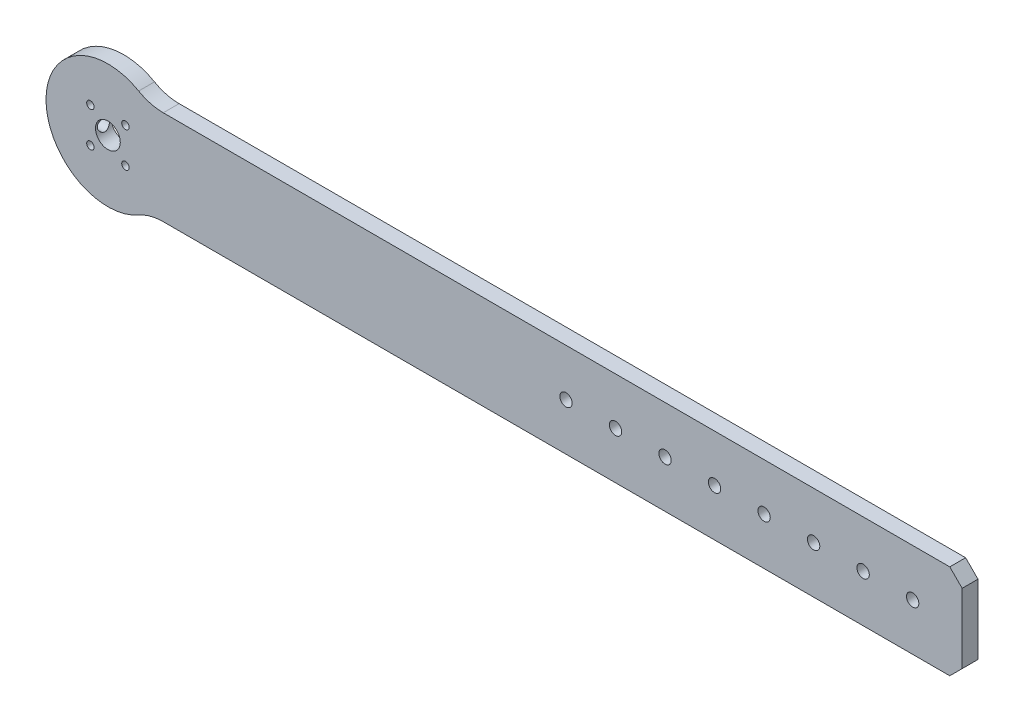
ISO-10303-21;
HEADER;
FILE_DESCRIPTION(('STEP AP214'),'2;1');
FILE_NAME('part.step','',(''),(''),'','','');
FILE_SCHEMA(('AUTOMOTIVE_DESIGN { 1 0 10303 214 1 1 1 1 }'));
ENDSEC;
DATA;
#1=APPLICATION_CONTEXT('core data for automotive mechanical design processes');
#2=APPLICATION_PROTOCOL_DEFINITION('international standard','automotive_design',2000,#1);
#3=PRODUCT_CONTEXT('',#1,'mechanical');
#4=PRODUCT('Part','Part','',(#3));
#5=PRODUCT_RELATED_PRODUCT_CATEGORY('part','',(#4));
#6=PRODUCT_DEFINITION_FORMATION('','',#4);
#7=PRODUCT_DEFINITION_CONTEXT('part definition',#1,'design');
#8=PRODUCT_DEFINITION('design','',#6,#7);
#9=PRODUCT_DEFINITION_SHAPE('','',#8);
#10=(LENGTH_UNIT() NAMED_UNIT(*) SI_UNIT(.MILLI.,.METRE.));
#11=(NAMED_UNIT(*) PLANE_ANGLE_UNIT() SI_UNIT($,.RADIAN.));
#12=(NAMED_UNIT(*) SI_UNIT($,.STERADIAN.) SOLID_ANGLE_UNIT());
#13=UNCERTAINTY_MEASURE_WITH_UNIT(LENGTH_MEASURE(1.E-05),#10,'distance_accuracy_value','');
#14=(GEOMETRIC_REPRESENTATION_CONTEXT(3) GLOBAL_UNCERTAINTY_ASSIGNED_CONTEXT((#13)) GLOBAL_UNIT_ASSIGNED_CONTEXT((#10,
#11,#12)) REPRESENTATION_CONTEXT('',''));
#15=CARTESIAN_POINT('',(0.,0.,0.));
#16=DIRECTION('',(0.,0.,1.));
#17=DIRECTION('',(1.,0.,0.));
#18=AXIS2_PLACEMENT_3D('',#15,#16,#17);
#19=CARTESIAN_POINT('',(0.,0.,3.2));
#20=DIRECTION('',(0.,0.,1.));
#21=DIRECTION('',(1.,0.,0.));
#22=AXIS2_PLACEMENT_3D('',#19,#20,#21);
#23=PLANE('',#22);
#24=CARTESIAN_POINT('',(205.,-8.37955521322352E-13,3.2));
#25=DIRECTION('',(0.,0.,1.));
#26=DIRECTION('',(1.,0.,0.));
#27=AXIS2_PLACEMENT_3D('',#24,#25,#26);
#28=CIRCLE('',#27,2.50000000000002);
#29=CARTESIAN_POINT('',(207.5,-8.37955521322352E-13,3.2));
#30=VERTEX_POINT('',#29);
#31=EDGE_CURVE('E405',#30,#30,#28,.T.);
#32=ORIENTED_EDGE('',*,*,#31,.F.);
#33=EDGE_LOOP('',(#32));
#34=FACE_BOUND('',#33,.T.);
#35=CARTESIAN_POINT('',(245.,-5.58637014214901E-13,3.2));
#36=DIRECTION('',(0.,0.,1.));
#37=DIRECTION('',(1.,0.,0.));
#38=AXIS2_PLACEMENT_3D('',#35,#36,#37);
#39=CIRCLE('',#38,2.50000000000002);
#40=CARTESIAN_POINT('',(247.5,-5.58637014214901E-13,3.2));
#41=VERTEX_POINT('',#40);
#42=EDGE_CURVE('E357',#41,#41,#39,.T.);
#43=ORIENTED_EDGE('',*,*,#42,.F.);
#44=EDGE_LOOP('',(#43));
#45=FACE_BOUND('',#44,.T.);
#46=CARTESIAN_POINT('',(285.,-2.79318507107451E-13,3.2));
#47=DIRECTION('',(0.,0.,1.));
#48=DIRECTION('',(1.,0.,0.));
#49=AXIS2_PLACEMENT_3D('',#46,#47,#48);
#50=CIRCLE('',#49,2.50000000000002);
#51=CARTESIAN_POINT('',(287.5,-2.79318507107451E-13,3.2));
#52=VERTEX_POINT('',#51);
#53=EDGE_CURVE('E348',#52,#52,#50,.T.);
#54=ORIENTED_EDGE('',*,*,#53,.F.);
#55=EDGE_LOOP('',(#54));
#56=FACE_BOUND('',#55,.T.);
#57=CARTESIAN_POINT('',(0.,0.,3.2));
#58=DIRECTION('',(0.,0.,1.));
#59=DIRECTION('',(1.,0.,0.));
#60=AXIS2_PLACEMENT_3D('',#57,#58,#59);
#61=CIRCLE('',#60,5.);
#62=CARTESIAN_POINT('',(5.,0.,3.2));
#63=VERTEX_POINT('',#62);
#64=EDGE_CURVE('E248',#63,#63,#61,.T.);
#65=ORIENTED_EDGE('',*,*,#64,.F.);
#66=EDGE_LOOP('',(#65));
#67=FACE_BOUND('',#66,.T.);
#68=CARTESIAN_POINT('',(-7.07106781186551,-7.07106781186544,3.2));
#69=DIRECTION('',(0.,0.,1.));
#70=DIRECTION('',(1.,0.,0.));
#71=AXIS2_PLACEMENT_3D('',#68,#69,#70);
#72=CIRCLE('',#71,1.5);
#73=CARTESIAN_POINT('',(-5.57106781186551,-7.07106781186544,3.2));
#74=VERTEX_POINT('',#73);
#75=EDGE_CURVE('E260',#74,#74,#72,.T.);
#76=ORIENTED_EDGE('',*,*,#75,.F.);
#77=EDGE_LOOP('',(#76));
#78=FACE_BOUND('',#77,.T.);
#79=CARTESIAN_POINT('',(325.,0.,3.2));
#80=DIRECTION('',(0.,0.,1.));
#81=DIRECTION('',(1.,0.,0.));
#82=AXIS2_PLACEMENT_3D('',#79,#80,#81);
#83=CIRCLE('',#82,2.50000000000002);
#84=CARTESIAN_POINT('',(327.5,0.,3.2));
#85=VERTEX_POINT('',#84);
#86=EDGE_CURVE('E276',#85,#85,#83,.T.);
#87=ORIENTED_EDGE('',*,*,#86,.F.);
#88=EDGE_LOOP('',(#87));
#89=FACE_BOUND('',#88,.T.);
#90=DIRECTION('',(1.,0.,0.));
#91=VECTOR('',#90,1.);
#92=CARTESIAN_POINT('',(345.,-19.05,3.2));
#93=LINE('',#92,#91);
#94=CARTESIAN_POINT('',(22.3628598350032,-19.05,3.2));
#95=VERTEX_POINT('',#94);
#96=CARTESIAN_POINT('',(340.,-19.05,3.2));
#97=VERTEX_POINT('',#96);
#98=EDGE_CURVE('E124',#95,#97,#93,.T.);
#99=ORIENTED_EDGE('',*,*,#98,.T.);
#100=DIRECTION('',(-0.707106781186551,-0.707106781186544,0.));
#101=VECTOR('',#100,1.);
#102=CARTESIAN_POINT('',(179.524999999998,-179.525,3.2));
#103=LINE('',#102,#101);
#104=CARTESIAN_POINT('',(345.,-14.05,3.2));
#105=VERTEX_POINT('',#104);
#106=EDGE_CURVE('E48',#97,#105,#103,.F.);
#107=ORIENTED_EDGE('',*,*,#106,.T.);
#108=DIRECTION('',(0.,1.,0.));
#109=VECTOR('',#108,1.);
#110=CARTESIAN_POINT('',(345.,19.05,3.2));
#111=LINE('',#110,#109);
#112=CARTESIAN_POINT('',(345.,14.0499999999999,3.2));
#113=VERTEX_POINT('',#112);
#114=EDGE_CURVE('E133',#105,#113,#111,.T.);
#115=ORIENTED_EDGE('',*,*,#114,.T.);
#116=DIRECTION('',(0.707106781186551,-0.707106781186544,0.));
#117=VECTOR('',#116,1.);
#118=CARTESIAN_POINT('',(179.524999999998,179.525,3.2));
#119=LINE('',#118,#117);
#120=CARTESIAN_POINT('',(340.,19.05,3.2));
#121=VERTEX_POINT('',#120);
#122=EDGE_CURVE('E55',#113,#121,#119,.F.);
#123=ORIENTED_EDGE('',*,*,#122,.T.);
#124=DIRECTION('',(-1.,0.,0.));
#125=VECTOR('',#124,1.);
#126=CARTESIAN_POINT('',(345.,19.05,3.2));
#127=LINE('',#126,#125);
#128=CARTESIAN_POINT('',(22.3628598350032,19.05,3.2));
#129=VERTEX_POINT('',#128);
#130=EDGE_CURVE('E139',#121,#129,#127,.T.);
#131=ORIENTED_EDGE('',*,*,#130,.T.);
#132=CARTESIAN_POINT('',(22.3628598350032,39.05,3.2));
#133=DIRECTION('',(0.,0.,1.));
#134=DIRECTION('',(1.,0.,0.));
#135=AXIS2_PLACEMENT_3D('',#132,#133,#134);
#136=CIRCLE('',#135,20.);
#137=CARTESIAN_POINT('',(12.4238110194462,21.6944444444445,3.2));
#138=VERTEX_POINT('',#137);
#139=EDGE_CURVE('E313',#129,#138,#136,.F.);
#140=ORIENTED_EDGE('',*,*,#139,.T.);
#141=CARTESIAN_POINT('',(0.,0.,3.2));
#142=DIRECTION('',(0.,0.,1.));
#143=DIRECTION('',(1.,0.,0.));
#144=AXIS2_PLACEMENT_3D('',#141,#142,#143);
#145=CIRCLE('',#144,25.);
#146=CARTESIAN_POINT('',(12.4238110194462,-21.6944444444445,3.2));
#147=VERTEX_POINT('',#146);
#148=EDGE_CURVE('E294',#138,#147,#145,.T.);
#149=ORIENTED_EDGE('',*,*,#148,.T.);
#150=CARTESIAN_POINT('',(22.3628598350032,-39.05,3.2));
#151=DIRECTION('',(0.,0.,1.));
#152=DIRECTION('',(1.,0.,0.));
#153=AXIS2_PLACEMENT_3D('',#150,#151,#152);
#154=CIRCLE('',#153,20.);
#155=EDGE_CURVE('E119',#147,#95,#154,.F.);
#156=ORIENTED_EDGE('',*,*,#155,.T.);
#157=EDGE_LOOP('',(#99,#107,#115,#123,#131,#140,#149,#156));
#158=FACE_BOUND('',#157,.T.);
#159=CARTESIAN_POINT('',(7.07106781186546,7.07106781186549,3.2));
#160=DIRECTION('',(0.,0.,1.));
#161=DIRECTION('',(1.,0.,0.));
#162=AXIS2_PLACEMENT_3D('',#159,#160,#161);
#163=CIRCLE('',#162,1.5);
#164=CARTESIAN_POINT('',(8.57106781186546,7.07106781186549,3.2));
#165=VERTEX_POINT('',#164);
#166=EDGE_CURVE('E284',#165,#165,#163,.T.);
#167=ORIENTED_EDGE('',*,*,#166,.F.);
#168=EDGE_LOOP('',(#167));
#169=FACE_BOUND('',#168,.T.);
#170=CARTESIAN_POINT('',(7.07106781186546,-7.07106781186549,3.2));
#171=DIRECTION('',(0.,0.,1.));
#172=DIRECTION('',(1.,0.,0.));
#173=AXIS2_PLACEMENT_3D('',#170,#171,#172);
#174=CIRCLE('',#173,1.5);
#175=CARTESIAN_POINT('',(8.57106781186546,-7.07106781186549,3.2));
#176=VERTEX_POINT('',#175);
#177=EDGE_CURVE('E268',#176,#176,#174,.T.);
#178=ORIENTED_EDGE('',*,*,#177,.F.);
#179=EDGE_LOOP('',(#178));
#180=FACE_BOUND('',#179,.T.);
#181=CARTESIAN_POINT('',(-7.07106781186542,7.07106781186554,3.2));
#182=DIRECTION('',(0.,0.,1.));
#183=DIRECTION('',(1.,0.,0.));
#184=AXIS2_PLACEMENT_3D('',#181,#182,#183);
#185=CIRCLE('',#184,1.5);
#186=CARTESIAN_POINT('',(-5.57106781186542,7.07106781186554,3.2));
#187=VERTEX_POINT('',#186);
#188=EDGE_CURVE('E242',#187,#187,#185,.T.);
#189=ORIENTED_EDGE('',*,*,#188,.F.);
#190=EDGE_LOOP('',(#189));
#191=FACE_BOUND('',#190,.T.);
#192=CARTESIAN_POINT('',(305.,-1.39659253553725E-13,3.2));
#193=DIRECTION('',(0.,0.,1.));
#194=DIRECTION('',(1.,0.,0.));
#195=AXIS2_PLACEMENT_3D('',#192,#193,#194);
#196=CIRCLE('',#195,2.50000000000002);
#197=CARTESIAN_POINT('',(307.5,-1.39659253553725E-13,3.2));
#198=VERTEX_POINT('',#197);
#199=EDGE_CURVE('E373',#198,#198,#196,.T.);
#200=ORIENTED_EDGE('',*,*,#199,.F.);
#201=EDGE_LOOP('',(#200));
#202=FACE_BOUND('',#201,.T.);
#203=CARTESIAN_POINT('',(265.,-4.18977760661176E-13,3.2));
#204=DIRECTION('',(0.,0.,1.));
#205=DIRECTION('',(1.,0.,0.));
#206=AXIS2_PLACEMENT_3D('',#203,#204,#205);
#207=CIRCLE('',#206,2.50000000000002);
#208=CARTESIAN_POINT('',(267.5,-4.18977760661176E-13,3.2));
#209=VERTEX_POINT('',#208);
#210=EDGE_CURVE('E356',#209,#209,#207,.T.);
#211=ORIENTED_EDGE('',*,*,#210,.F.);
#212=EDGE_LOOP('',(#211));
#213=FACE_BOUND('',#212,.T.);
#214=CARTESIAN_POINT('',(225.,-6.98296267768627E-13,3.2));
#215=DIRECTION('',(0.,0.,1.));
#216=DIRECTION('',(1.,0.,0.));
#217=AXIS2_PLACEMENT_3D('',#214,#215,#216);
#218=CIRCLE('',#217,2.50000000000002);
#219=CARTESIAN_POINT('',(227.5,-6.98296267768627E-13,3.2));
#220=VERTEX_POINT('',#219);
#221=EDGE_CURVE('E411',#220,#220,#218,.T.);
#222=ORIENTED_EDGE('',*,*,#221,.F.);
#223=EDGE_LOOP('',(#222));
#224=FACE_BOUND('',#223,.T.);
#225=CARTESIAN_POINT('',(185.,-9.77614774876077E-13,3.2));
#226=DIRECTION('',(0.,0.,1.));
#227=DIRECTION('',(1.,0.,0.));
#228=AXIS2_PLACEMENT_3D('',#225,#226,#227);
#229=CIRCLE('',#228,2.50000000000002);
#230=CARTESIAN_POINT('',(187.5,-9.77614774876077E-13,3.2));
#231=VERTEX_POINT('',#230);
#232=EDGE_CURVE('E177',#231,#231,#229,.T.);
#233=ORIENTED_EDGE('',*,*,#232,.F.);
#234=EDGE_LOOP('',(#233));
#235=FACE_BOUND('',#234,.T.);
#236=ADVANCED_FACE('F39',(#34,#45,#56,#67,#78,#89,#158,#169,#180,#191,#202,#213,#224,#235),#23,.T.);
#237=CARTESIAN_POINT('',(0.,0.,-3.2));
#238=DIRECTION('',(0.,0.,1.));
#239=DIRECTION('',(1.,0.,0.));
#240=AXIS2_PLACEMENT_3D('',#237,#238,#239);
#241=PLANE('',#240);
#242=DIRECTION('',(0.,1.,0.));
#243=VECTOR('',#242,1.);
#244=CARTESIAN_POINT('',(345.,19.05,-3.2));
#245=LINE('',#244,#243);
#246=CARTESIAN_POINT('',(345.,-14.05,-3.2));
#247=VERTEX_POINT('',#246);
#248=CARTESIAN_POINT('',(345.,14.0499999999999,-3.2));
#249=VERTEX_POINT('',#248);
#250=EDGE_CURVE('E288',#247,#249,#245,.T.);
#251=ORIENTED_EDGE('',*,*,#250,.F.);
#252=DIRECTION('',(0.707106781186551,0.707106781186544,0.));
#253=VECTOR('',#252,1.);
#254=CARTESIAN_POINT('',(345.,-14.0500000000001,-3.2));
#255=LINE('',#254,#253);
#256=CARTESIAN_POINT('',(340.,-19.05,-3.2));
#257=VERTEX_POINT('',#256);
#258=EDGE_CURVE('E131',#247,#257,#255,.F.);
#259=ORIENTED_EDGE('',*,*,#258,.T.);
#260=DIRECTION('',(1.,0.,0.));
#261=VECTOR('',#260,1.);
#262=CARTESIAN_POINT('',(345.,-19.05,-3.2));
#263=LINE('',#262,#261);
#264=CARTESIAN_POINT('',(22.3628598350032,-19.05,-3.2));
#265=VERTEX_POINT('',#264);
#266=EDGE_CURVE('E123',#265,#257,#263,.T.);
#267=ORIENTED_EDGE('',*,*,#266,.F.);
#268=CARTESIAN_POINT('',(22.3628598350032,-39.05,-3.2));
#269=DIRECTION('',(0.,0.,1.));
#270=DIRECTION('',(1.,0.,0.));
#271=AXIS2_PLACEMENT_3D('',#268,#269,#270);
#272=CIRCLE('',#271,20.);
#273=CARTESIAN_POINT('',(12.4238110194462,-21.6944444444445,-3.2));
#274=VERTEX_POINT('',#273);
#275=EDGE_CURVE('E108',#265,#274,#272,.T.);
#276=ORIENTED_EDGE('',*,*,#275,.T.);
#277=CARTESIAN_POINT('',(0.,0.,-3.2));
#278=DIRECTION('',(0.,0.,1.));
#279=DIRECTION('',(1.,0.,0.));
#280=AXIS2_PLACEMENT_3D('',#277,#278,#279);
#281=CIRCLE('',#280,25.);
#282=CARTESIAN_POINT('',(12.4238110194462,21.6944444444445,-3.2));
#283=VERTEX_POINT('',#282);
#284=EDGE_CURVE('E134',#283,#274,#281,.T.);
#285=ORIENTED_EDGE('',*,*,#284,.F.);
#286=CARTESIAN_POINT('',(22.3628598350032,39.05,-3.2));
#287=DIRECTION('',(0.,0.,1.));
#288=DIRECTION('',(1.,0.,0.));
#289=AXIS2_PLACEMENT_3D('',#286,#287,#288);
#290=CIRCLE('',#289,20.);
#291=CARTESIAN_POINT('',(22.3628598350032,19.05,-3.2));
#292=VERTEX_POINT('',#291);
#293=EDGE_CURVE('E309',#283,#292,#290,.T.);
#294=ORIENTED_EDGE('',*,*,#293,.T.);
#295=DIRECTION('',(-1.,0.,0.));
#296=VECTOR('',#295,1.);
#297=CARTESIAN_POINT('',(345.,19.05,-3.2));
#298=LINE('',#297,#296);
#299=CARTESIAN_POINT('',(340.,19.05,-3.2));
#300=VERTEX_POINT('',#299);
#301=EDGE_CURVE('E142',#300,#292,#298,.T.);
#302=ORIENTED_EDGE('',*,*,#301,.F.);
#303=DIRECTION('',(-0.707106781186551,0.707106781186544,0.));
#304=VECTOR('',#303,1.);
#305=CARTESIAN_POINT('',(340.,19.05,-3.2));
#306=LINE('',#305,#304);
#307=EDGE_CURVE('E331',#300,#249,#306,.F.);
#308=ORIENTED_EDGE('',*,*,#307,.T.);
#309=EDGE_LOOP('',(#251,#259,#267,#276,#285,#294,#302,#308));
#310=FACE_BOUND('',#309,.T.);
#311=CARTESIAN_POINT('',(7.07106781186546,7.07106781186549,-3.2));
#312=DIRECTION('',(0.,0.,1.));
#313=DIRECTION('',(1.,0.,0.));
#314=AXIS2_PLACEMENT_3D('',#311,#312,#313);
#315=CIRCLE('',#314,1.5);
#316=CARTESIAN_POINT('',(8.57106781186546,7.07106781186549,-3.2));
#317=VERTEX_POINT('',#316);
#318=EDGE_CURVE('E280',#317,#317,#315,.T.);
#319=ORIENTED_EDGE('',*,*,#318,.T.);
#320=EDGE_LOOP('',(#319));
#321=FACE_BOUND('',#320,.T.);
#322=CARTESIAN_POINT('',(325.,0.,-3.2));
#323=DIRECTION('',(0.,0.,1.));
#324=DIRECTION('',(1.,0.,0.));
#325=AXIS2_PLACEMENT_3D('',#322,#323,#324);
#326=CIRCLE('',#325,2.50000000000002);
#327=CARTESIAN_POINT('',(327.5,0.,-3.2));
#328=VERTEX_POINT('',#327);
#329=EDGE_CURVE('E272',#328,#328,#326,.T.);
#330=ORIENTED_EDGE('',*,*,#329,.T.);
#331=EDGE_LOOP('',(#330));
#332=FACE_BOUND('',#331,.T.);
#333=CARTESIAN_POINT('',(7.07106781186546,-7.07106781186549,-3.2));
#334=DIRECTION('',(0.,0.,1.));
#335=DIRECTION('',(1.,0.,0.));
#336=AXIS2_PLACEMENT_3D('',#333,#334,#335);
#337=CIRCLE('',#336,1.5);
#338=CARTESIAN_POINT('',(8.57106781186546,-7.07106781186549,-3.2));
#339=VERTEX_POINT('',#338);
#340=EDGE_CURVE('E264',#339,#339,#337,.T.);
#341=ORIENTED_EDGE('',*,*,#340,.T.);
#342=EDGE_LOOP('',(#341));
#343=FACE_BOUND('',#342,.T.);
#344=CARTESIAN_POINT('',(-7.07106781186551,-7.07106781186544,-3.2));
#345=DIRECTION('',(0.,0.,1.));
#346=DIRECTION('',(1.,0.,0.));
#347=AXIS2_PLACEMENT_3D('',#344,#345,#346);
#348=CIRCLE('',#347,1.5);
#349=CARTESIAN_POINT('',(-5.57106781186551,-7.07106781186544,-3.2));
#350=VERTEX_POINT('',#349);
#351=EDGE_CURVE('E252',#350,#350,#348,.T.);
#352=ORIENTED_EDGE('',*,*,#351,.T.);
#353=EDGE_LOOP('',(#352));
#354=FACE_BOUND('',#353,.T.);
#355=CARTESIAN_POINT('',(-7.07106781186542,7.07106781186554,-3.2));
#356=DIRECTION('',(0.,0.,1.));
#357=DIRECTION('',(1.,0.,0.));
#358=AXIS2_PLACEMENT_3D('',#355,#356,#357);
#359=CIRCLE('',#358,1.5);
#360=CARTESIAN_POINT('',(-5.57106781186542,7.07106781186554,-3.2));
#361=VERTEX_POINT('',#360);
#362=EDGE_CURVE('E245',#361,#361,#359,.T.);
#363=ORIENTED_EDGE('',*,*,#362,.T.);
#364=EDGE_LOOP('',(#363));
#365=FACE_BOUND('',#364,.T.);
#366=CARTESIAN_POINT('',(0.,0.,-3.2));
#367=DIRECTION('',(0.,0.,1.));
#368=DIRECTION('',(1.,0.,0.));
#369=AXIS2_PLACEMENT_3D('',#366,#367,#368);
#370=CIRCLE('',#369,5.);
#371=CARTESIAN_POINT('',(5.,0.,-3.2));
#372=VERTEX_POINT('',#371);
#373=EDGE_CURVE('E256',#372,#372,#370,.T.);
#374=ORIENTED_EDGE('',*,*,#373,.T.);
#375=EDGE_LOOP('',(#374));
#376=FACE_BOUND('',#375,.T.);
#377=CARTESIAN_POINT('',(305.,-1.39659253553725E-13,-3.2));
#378=DIRECTION('',(0.,0.,1.));
#379=DIRECTION('',(1.,0.,0.));
#380=AXIS2_PLACEMENT_3D('',#377,#378,#379);
#381=CIRCLE('',#380,2.50000000000002);
#382=CARTESIAN_POINT('',(307.5,-1.39659253553725E-13,-3.2));
#383=VERTEX_POINT('',#382);
#384=EDGE_CURVE('E350',#383,#383,#381,.T.);
#385=ORIENTED_EDGE('',*,*,#384,.T.);
#386=EDGE_LOOP('',(#385));
#387=FACE_BOUND('',#386,.T.);
#388=CARTESIAN_POINT('',(285.,-2.79318507107451E-13,-3.2));
#389=DIRECTION('',(0.,0.,1.));
#390=DIRECTION('',(1.,0.,0.));
#391=AXIS2_PLACEMENT_3D('',#388,#389,#390);
#392=CIRCLE('',#391,2.50000000000002);
#393=CARTESIAN_POINT('',(287.5,-2.79318507107451E-13,-3.2));
#394=VERTEX_POINT('',#393);
#395=EDGE_CURVE('E351',#394,#394,#392,.T.);
#396=ORIENTED_EDGE('',*,*,#395,.T.);
#397=EDGE_LOOP('',(#396));
#398=FACE_BOUND('',#397,.T.);
#399=CARTESIAN_POINT('',(265.,-4.18977760661176E-13,-3.2));
#400=DIRECTION('',(0.,0.,1.));
#401=DIRECTION('',(1.,0.,0.));
#402=AXIS2_PLACEMENT_3D('',#399,#400,#401);
#403=CIRCLE('',#402,2.50000000000002);
#404=CARTESIAN_POINT('',(267.5,-4.18977760661176E-13,-3.2));
#405=VERTEX_POINT('',#404);
#406=EDGE_CURVE('E354',#405,#405,#403,.T.);
#407=ORIENTED_EDGE('',*,*,#406,.T.);
#408=EDGE_LOOP('',(#407));
#409=FACE_BOUND('',#408,.T.);
#410=CARTESIAN_POINT('',(245.,-5.58637014214901E-13,-3.2));
#411=DIRECTION('',(0.,0.,1.));
#412=DIRECTION('',(1.,0.,0.));
#413=AXIS2_PLACEMENT_3D('',#410,#411,#412);
#414=CIRCLE('',#413,2.50000000000002);
#415=CARTESIAN_POINT('',(247.5,-5.58637014214901E-13,-3.2));
#416=VERTEX_POINT('',#415);
#417=EDGE_CURVE('E366',#416,#416,#414,.T.);
#418=ORIENTED_EDGE('',*,*,#417,.T.);
#419=EDGE_LOOP('',(#418));
#420=FACE_BOUND('',#419,.T.);
#421=CARTESIAN_POINT('',(225.,-6.98296267768627E-13,-3.2));
#422=DIRECTION('',(0.,0.,1.));
#423=DIRECTION('',(1.,0.,0.));
#424=AXIS2_PLACEMENT_3D('',#421,#422,#423);
#425=CIRCLE('',#424,2.50000000000002);
#426=CARTESIAN_POINT('',(227.5,-6.98296267768627E-13,-3.2));
#427=VERTEX_POINT('',#426);
#428=EDGE_CURVE('E394',#427,#427,#425,.T.);
#429=ORIENTED_EDGE('',*,*,#428,.T.);
#430=EDGE_LOOP('',(#429));
#431=FACE_BOUND('',#430,.T.);
#432=CARTESIAN_POINT('',(205.,-8.37955521322352E-13,-3.2));
#433=DIRECTION('',(0.,0.,1.));
#434=DIRECTION('',(1.,0.,0.));
#435=AXIS2_PLACEMENT_3D('',#432,#433,#434);
#436=CIRCLE('',#435,2.50000000000002);
#437=CARTESIAN_POINT('',(207.5,-8.37955521322352E-13,-3.2));
#438=VERTEX_POINT('',#437);
#439=EDGE_CURVE('E398',#438,#438,#436,.T.);
#440=ORIENTED_EDGE('',*,*,#439,.T.);
#441=EDGE_LOOP('',(#440));
#442=FACE_BOUND('',#441,.T.);
#443=CARTESIAN_POINT('',(185.,-9.77614774876077E-13,-3.2));
#444=DIRECTION('',(0.,0.,1.));
#445=DIRECTION('',(1.,0.,0.));
#446=AXIS2_PLACEMENT_3D('',#443,#444,#445);
#447=CIRCLE('',#446,2.50000000000002);
#448=CARTESIAN_POINT('',(187.5,-9.77614774876077E-13,-3.2));
#449=VERTEX_POINT('',#448);
#450=EDGE_CURVE('E176',#449,#449,#447,.T.);
#451=ORIENTED_EDGE('',*,*,#450,.T.);
#452=EDGE_LOOP('',(#451));
#453=FACE_BOUND('',#452,.T.);
#454=ADVANCED_FACE('F129',(#310,#321,#332,#343,#354,#365,#376,#387,#398,#409,#420,#431,#442,
#453),#241,.F.);
#455=CARTESIAN_POINT('',(345.,19.05,3.2));
#456=DIRECTION('',(-1.,0.,0.));
#457=DIRECTION('',(0.,0.,1.));
#458=AXIS2_PLACEMENT_3D('',#455,#456,#457);
#459=PLANE('',#458);
#460=ORIENTED_EDGE('',*,*,#114,.F.);
#461=DIRECTION('',(0.,0.,-1.));
#462=VECTOR('',#461,1.);
#463=CARTESIAN_POINT('',(345.,-14.0500000000001,3.2));
#464=LINE('',#463,#462);
#465=EDGE_CURVE('E327',#105,#247,#464,.T.);
#466=ORIENTED_EDGE('',*,*,#465,.T.);
#467=ORIENTED_EDGE('',*,*,#250,.T.);
#468=DIRECTION('',(0.,0.,1.));
#469=VECTOR('',#468,1.);
#470=CARTESIAN_POINT('',(345.,14.0499999999999,3.2));
#471=LINE('',#470,#469);
#472=EDGE_CURVE('E324',#249,#113,#471,.T.);
#473=ORIENTED_EDGE('',*,*,#472,.T.);
#474=EDGE_LOOP('',(#460,#466,#467,#473));
#475=FACE_BOUND('',#474,.T.);
#476=ADVANCED_FACE('F189',(#475),#459,.F.);
#477=CARTESIAN_POINT('',(345.,19.05,3.2));
#478=DIRECTION('',(0.,-1.,0.));
#479=DIRECTION('',(1.,0.,0.));
#480=AXIS2_PLACEMENT_3D('',#477,#478,#479);
#481=PLANE('',#480);
#482=ORIENTED_EDGE('',*,*,#130,.F.);
#483=DIRECTION('',(0.,0.,-1.));
#484=VECTOR('',#483,1.);
#485=CARTESIAN_POINT('',(340.,19.05,3.2));
#486=LINE('',#485,#484);
#487=EDGE_CURVE('E11',#121,#300,#486,.T.);
#488=ORIENTED_EDGE('',*,*,#487,.T.);
#489=ORIENTED_EDGE('',*,*,#301,.T.);
#490=DIRECTION('',(0.,0.,1.));
#491=VECTOR('',#490,1.);
#492=CARTESIAN_POINT('',(22.3628598350032,19.05,3.2));
#493=LINE('',#492,#491);
#494=EDGE_CURVE('E120',#292,#129,#493,.T.);
#495=ORIENTED_EDGE('',*,*,#494,.T.);
#496=EDGE_LOOP('',(#482,#488,#489,#495));
#497=FACE_BOUND('',#496,.T.);
#498=ADVANCED_FACE('F184',(#497),#481,.F.);
#499=CARTESIAN_POINT('',(0.,0.,3.2));
#500=DIRECTION('',(0.,0.,-1.));
#501=DIRECTION('',(-1.,0.,0.));
#502=AXIS2_PLACEMENT_3D('',#499,#500,#501);
#503=CYLINDRICAL_SURFACE('',#502,25.);
#504=CARTESIAN_POINT('',(-25.,0.,-2.5));
#505=CARTESIAN_POINT('',(-24.9999983880192,0.140050884478893,-2.49999393524905));
#506=CARTESIAN_POINT('',(-24.9988106399051,0.280194362919433,-2.48819182775889));
#507=CARTESIAN_POINT('',(-24.9941866898684,0.556595996242093,-2.44128907427393));
#508=CARTESIAN_POINT('',(-24.9907480108506,0.69284969792207,-2.40616275993853));
#509=CARTESIAN_POINT('',(-24.9820103640768,0.957429188633536,-2.31364439850542));
#510=CARTESIAN_POINT('',(-24.9767125200177,1.08575971153727,-2.25626579870381));
#511=CARTESIAN_POINT('',(-24.9648489348577,1.33094040240102,-2.12089773017089));
#512=CARTESIAN_POINT('',(-24.9582834459533,1.44779284694769,-2.04291235999965));
#513=CARTESIAN_POINT('',(-24.9445936085331,1.6671488766852,-1.86824325584431));
#514=CARTESIAN_POINT('',(-24.9374675393466,1.76960536208723,-1.77150050149492));
#515=CARTESIAN_POINT('',(-24.9234739226566,1.95685630357746,-1.56218866434242));
#516=CARTESIAN_POINT('',(-24.9166063871229,2.04164994270663,-1.44961884989403));
#517=CARTESIAN_POINT('',(-24.9038897888196,2.19133492610904,-1.21155367079095));
#518=CARTESIAN_POINT('',(-24.8980429177726,2.2561836636372,-1.08603138976285));
#519=CARTESIAN_POINT('',(-24.8880509386631,2.3638659618569,-0.825811035237553));
#520=CARTESIAN_POINT('',(-24.8839057885556,2.40670006647823,-0.691113188540125));
#521=CARTESIAN_POINT('',(-24.8778021018244,2.46899760400473,-0.416845497834976));
#522=CARTESIAN_POINT('',(-24.8758362599524,2.48853913250949,-0.277293557869479));
#523=CARTESIAN_POINT('',(-24.8742910765131,2.5039382128384,0.00312215848945159));
#524=CARTESIAN_POINT('',(-24.8747116722186,2.499796387177,0.143985900305148));
#525=CARTESIAN_POINT('',(-24.8778851724734,2.4680107006317,0.422488274233296));
#526=CARTESIAN_POINT('',(-24.8806296147663,2.44045211031138,0.560136748321736));
#527=CARTESIAN_POINT('',(-24.8881283571855,2.36274786037647,0.828844908002736));
#528=CARTESIAN_POINT('',(-24.8928826844623,2.31260189563937,0.959904504562578));
#529=CARTESIAN_POINT('',(-24.9038752363018,2.19105223470377,1.21198396824722));
#530=CARTESIAN_POINT('',(-24.9101160977039,2.11961070679995,1.33298547372329));
#531=CARTESIAN_POINT('',(-24.923376293322,1.95752506838307,1.56131303727971));
#532=CARTESIAN_POINT('',(-24.9303956503196,1.86688039584126,1.66863869495441));
#533=CARTESIAN_POINT('',(-24.9444596328247,1.66848528103017,1.86706348497257));
#534=CARTESIAN_POINT('',(-24.9515042333249,1.56066119712841,1.95808900470201));
#535=CARTESIAN_POINT('',(-24.964795726963,1.33122370434278,2.12075908227597));
#536=CARTESIAN_POINT('',(-24.9710426192064,1.209610279999,2.19240361839119));
#537=CARTESIAN_POINT('',(-24.9820368916774,0.955995264230912,2.31427505077563));
#538=CARTESIAN_POINT('',(-24.9867840103692,0.823991865974758,2.36449821204515));
#539=CARTESIAN_POINT('',(-24.9942411860352,0.55336804332483,2.44204729177938));
#540=CARTESIAN_POINT('',(-24.9969513039266,0.414747816941501,2.46937389497656));
#541=CARTESIAN_POINT('',(-25.0000212917078,0.135462747729759,2.50026076933691));
#542=CARTESIAN_POINT('',(-25.0003912066934,-0.00519075526373,2.50392262063125));
#543=CARTESIAN_POINT('',(-24.9987660439199,-0.285109483289249,2.48764284237809));
#544=CARTESIAN_POINT('',(-24.9967709981117,-0.424374727051175,2.4677015317118));
#545=CARTESIAN_POINT('',(-24.9906465384799,-0.697270517086686,2.40486576144606));
#546=CARTESIAN_POINT('',(-24.986521547951,-0.830912122430047,2.36201886380497));
#547=CARTESIAN_POINT('',(-24.9765999715152,-1.08911080345945,2.25463706490682));
#548=CARTESIAN_POINT('',(-24.9708033481313,-1.21366767539279,2.19010167740151));
#549=CARTESIAN_POINT('',(-24.9581618832606,-1.45062045043036,2.04092290334022));
#550=CARTESIAN_POINT('',(-24.951313590086,-1.56297414937229,1.95621277768546));
#551=CARTESIAN_POINT('',(-24.937348321738,-1.77190405827969,1.76918483064768));
#552=CARTESIAN_POINT('',(-24.9302313398243,-1.86847987212294,1.66686656732421));
#553=CARTESIAN_POINT('',(-24.9165006035189,-2.04346527471786,1.4470835633525));
#554=CARTESIAN_POINT('',(-24.9098887534744,-2.12180819669886,1.32956560864345));
#555=CARTESIAN_POINT('',(-24.8979458115222,-2.25764564685957,1.08298159963329));
#556=CARTESIAN_POINT('',(-24.8926147021009,-2.3151404601347,0.953915703279011));
#557=CARTESIAN_POINT('',(-24.8838486908512,-2.40753802171119,0.688128151335515));
#558=CARTESIAN_POINT('',(-24.8804104612447,-2.44248043702965,0.551420399772198));
#559=CARTESIAN_POINT('',(-24.8758091320719,-2.48891001782366,0.27404200509807));
#560=CARTESIAN_POINT('',(-24.8746459672547,-2.50039785599879,0.133371475760815));
#561=CARTESIAN_POINT('',(-24.8747278276891,-2.49958284617814,-0.147276720891761));
#562=CARTESIAN_POINT('',(-24.8759622521752,-2.48738472398278,-0.287254707207037));
#563=CARTESIAN_POINT('',(-24.8806775972386,-2.43976363240913,-0.56316229292072));
#564=CARTESIAN_POINT('',(-24.884158520343,-2.4043406369054,-0.699091887764949));
#565=CARTESIAN_POINT('',(-24.8929717065797,-2.31130421574376,-0.963043372619642));
#566=CARTESIAN_POINT('',(-24.898303713509,-2.25369386085229,-1.09106635407431));
#567=CARTESIAN_POINT('',(-24.910218795984,-2.11792888727761,-1.33564222917759));
#568=CARTESIAN_POINT('',(-24.9168018645238,-2.03977438363854,-1.45219518705157));
#569=CARTESIAN_POINT('',(-24.9305121802424,-1.86474639071333,-1.67105918617984));
#570=CARTESIAN_POINT('',(-24.9376416181688,-1.76779487222567,-1.77330769091771));
#571=CARTESIAN_POINT('',(-24.9516213682196,-1.55807924806277,-1.96013058174914));
#572=CARTESIAN_POINT('',(-24.9584716130744,-1.44531136027064,-2.04470072839292));
#573=CARTESIAN_POINT('',(-24.971139051729,-1.20685358540322,-2.19393363463655));
#574=CARTESIAN_POINT('',(-24.9769536006703,-1.08113187336691,-2.25854572736296));
#575=CARTESIAN_POINT('',(-24.9868657312474,-0.820645697751377,-2.36565605705967));
#576=CARTESIAN_POINT('',(-24.9909652477413,-0.685891624564023,-2.40817922738387));
#577=CARTESIAN_POINT('',(-24.9959553443433,-0.458645653514261,-2.459301542712));
#578=CARTESIAN_POINT('',(-24.9974650172958,-0.367606382111273,-2.47454261074839));
#579=CARTESIAN_POINT('',(-24.9994878737697,-0.184391452043283,-2.4948938151544));
#580=CARTESIAN_POINT('',(-25.0000010614006,-0.0922157980663948,-2.50000399330465));
#581=CARTESIAN_POINT('',(-25.,0.,-2.5));
#582=B_SPLINE_CURVE_WITH_KNOTS('',3,(#504,#505,#506,#507,#508,#509,#510,#511,#512,#513,#514,
#515,#516,#517,#518,#519,#520,#521,#522,#523,#524,#525,#526,#527,#528,#529,#530,#531,#532,#533,
#534,#535,#536,#537,#538,#539,#540,#541,#542,#543,#544,#545,#546,#547,#548,#549,#550,#551,#552,
#553,#554,#555,#556,#557,#558,#559,#560,#561,#562,#563,#564,#565,#566,#567,#568,#569,#570,#571,
#572,#573,#574,#575,#576,#577,#578,#579,#580,#581),.UNSPECIFIED.,.T.,.F.,(4,2,2,2,2,2,2,2,2,2,2,
2,2,2,2,2,2,2,2,2,2,2,2,2,2,2,2,2,2,2,2,2,2,2,2,2,2,2,4),(0.,0.419815915671184,
0.840094607088716,1.26011971433051,1.68006134395696,2.10134642155736,2.52265098051765,
2.94484938680554,3.3670373610626,3.78780580112991,4.20856318139441,4.62779493602776,
5.04703235404084,5.46701903432236,5.88701800827813,6.30886835490516,6.73071917449429,
7.15264351733954,7.57455524188599,7.99465471519394,8.41474851297859,8.83397338235762,
9.25320765123667,9.67384851871746,10.0944999452557,10.516666090215,10.9388264618844,
11.3602422648251,11.7816459809896,12.2011907323489,12.620735955651,13.04022313407,
13.459707963474,13.8809729356913,14.3023388159239,14.7247657756561,15.1467148698824,
15.4231416808087,15.6995673517257),.UNSPECIFIED.);
#583=CARTESIAN_POINT('',(-25.,0.,-2.5));
#584=VERTEX_POINT('',#583);
#585=EDGE_CURVE('E154',#584,#584,#582,.T.);
#586=ORIENTED_EDGE('',*,*,#585,.T.);
#587=EDGE_LOOP('',(#586));
#588=FACE_BOUND('',#587,.T.);
#589=ORIENTED_EDGE('',*,*,#284,.T.);
#590=DIRECTION('',(0.,0.,-1.));
#591=VECTOR('',#590,1.);
#592=CARTESIAN_POINT('',(12.4238110194462,-21.6944444444445,3.2));
#593=LINE('',#592,#591);
#594=EDGE_CURVE('E113',#274,#147,#593,.F.);
#595=ORIENTED_EDGE('',*,*,#594,.T.);
#596=ORIENTED_EDGE('',*,*,#148,.F.);
#597=DIRECTION('',(0.,0.,-1.));
#598=VECTOR('',#597,1.);
#599=CARTESIAN_POINT('',(12.4238110194462,21.6944444444445,3.2));
#600=LINE('',#599,#598);
#601=EDGE_CURVE('E126',#138,#283,#600,.T.);
#602=ORIENTED_EDGE('',*,*,#601,.T.);
#603=EDGE_LOOP('',(#589,#595,#596,#602));
#604=FACE_BOUND('',#603,.T.);
#605=ADVANCED_FACE('F179',(#588,#604),#503,.T.);
#606=CARTESIAN_POINT('',(345.,-19.05,3.2));
#607=DIRECTION('',(0.,1.,0.));
#608=DIRECTION('',(-1.,0.,0.));
#609=AXIS2_PLACEMENT_3D('',#606,#607,#608);
#610=PLANE('',#609);
#611=ORIENTED_EDGE('',*,*,#266,.T.);
#612=DIRECTION('',(0.,0.,1.));
#613=VECTOR('',#612,1.);
#614=CARTESIAN_POINT('',(340.,-19.05,3.2));
#615=LINE('',#614,#613);
#616=EDGE_CURVE('E63',#257,#97,#615,.T.);
#617=ORIENTED_EDGE('',*,*,#616,.T.);
#618=ORIENTED_EDGE('',*,*,#98,.F.);
#619=DIRECTION('',(0.,0.,1.));
#620=VECTOR('',#619,1.);
#621=CARTESIAN_POINT('',(22.3628598350032,-19.05,-3.2));
#622=LINE('',#621,#620);
#623=EDGE_CURVE('E112',#95,#265,#622,.F.);
#624=ORIENTED_EDGE('',*,*,#623,.T.);
#625=EDGE_LOOP('',(#611,#617,#618,#624));
#626=FACE_BOUND('',#625,.T.);
#627=ADVANCED_FACE('F122',(#626),#610,.F.);
#628=CARTESIAN_POINT('',(7.07106781186546,7.07106781186549,3.2));
#629=DIRECTION('',(0.,0.,-1.));
#630=DIRECTION('',(-1.,0.,0.));
#631=AXIS2_PLACEMENT_3D('',#628,#629,#630);
#632=CYLINDRICAL_SURFACE('',#631,1.5);
#633=ORIENTED_EDGE('',*,*,#166,.T.);
#634=EDGE_LOOP('',(#633));
#635=FACE_BOUND('',#634,.T.);
#636=ORIENTED_EDGE('',*,*,#318,.F.);
#637=EDGE_LOOP('',(#636));
#638=FACE_BOUND('',#637,.T.);
#639=ADVANCED_FACE('F216',(#635,#638),#632,.F.);
#640=CARTESIAN_POINT('',(325.,0.,3.2));
#641=DIRECTION('',(0.,0.,-1.));
#642=DIRECTION('',(-1.,0.,0.));
#643=AXIS2_PLACEMENT_3D('',#640,#641,#642);
#644=CYLINDRICAL_SURFACE('',#643,2.50000000000002);
#645=ORIENTED_EDGE('',*,*,#86,.T.);
#646=EDGE_LOOP('',(#645));
#647=FACE_BOUND('',#646,.T.);
#648=ORIENTED_EDGE('',*,*,#329,.F.);
#649=EDGE_LOOP('',(#648));
#650=FACE_BOUND('',#649,.T.);
#651=ADVANCED_FACE('F219',(#647,#650),#644,.F.);
#652=CARTESIAN_POINT('',(7.07106781186546,-7.07106781186549,3.2));
#653=DIRECTION('',(0.,0.,-1.));
#654=DIRECTION('',(-1.,0.,0.));
#655=AXIS2_PLACEMENT_3D('',#652,#653,#654);
#656=CYLINDRICAL_SURFACE('',#655,1.5);
#657=ORIENTED_EDGE('',*,*,#177,.T.);
#658=EDGE_LOOP('',(#657));
#659=FACE_BOUND('',#658,.T.);
#660=ORIENTED_EDGE('',*,*,#340,.F.);
#661=EDGE_LOOP('',(#660));
#662=FACE_BOUND('',#661,.T.);
#663=ADVANCED_FACE('F223',(#659,#662),#656,.F.);
#664=CARTESIAN_POINT('',(-7.07106781186551,-7.07106781186544,3.2));
#665=DIRECTION('',(0.,0.,-1.));
#666=DIRECTION('',(-1.,0.,0.));
#667=AXIS2_PLACEMENT_3D('',#664,#665,#666);
#668=CYLINDRICAL_SURFACE('',#667,1.5);
#669=ORIENTED_EDGE('',*,*,#75,.T.);
#670=EDGE_LOOP('',(#669));
#671=FACE_BOUND('',#670,.T.);
#672=ORIENTED_EDGE('',*,*,#351,.F.);
#673=EDGE_LOOP('',(#672));
#674=FACE_BOUND('',#673,.T.);
#675=ADVANCED_FACE('F227',(#671,#674),#668,.F.);
#676=CARTESIAN_POINT('',(-7.07106781186542,7.07106781186554,3.2));
#677=DIRECTION('',(0.,0.,-1.));
#678=DIRECTION('',(-1.,0.,0.));
#679=AXIS2_PLACEMENT_3D('',#676,#677,#678);
#680=CYLINDRICAL_SURFACE('',#679,1.5);
#681=ORIENTED_EDGE('',*,*,#188,.T.);
#682=EDGE_LOOP('',(#681));
#683=FACE_BOUND('',#682,.T.);
#684=ORIENTED_EDGE('',*,*,#362,.F.);
#685=EDGE_LOOP('',(#684));
#686=FACE_BOUND('',#685,.T.);
#687=ADVANCED_FACE('F230',(#683,#686),#680,.F.);
#688=CARTESIAN_POINT('',(0.,0.,3.2));
#689=DIRECTION('',(0.,0.,-1.));
#690=DIRECTION('',(-1.,0.,0.));
#691=AXIS2_PLACEMENT_3D('',#688,#689,#690);
#692=CYLINDRICAL_SURFACE('',#691,5.);
#693=CARTESIAN_POINT('',(-5.,0.,2.5));
#694=CARTESIAN_POINT('',(-4.99999177550472,-0.131426682334305,2.49999033094399));
#695=CARTESIAN_POINT('',(-4.99476199135277,-0.263015634437213,2.48957443822597));
#696=CARTESIAN_POINT('',(-4.9743541856102,-0.522301454622883,2.44836817883795));
#697=CARTESIAN_POINT('',(-4.9591572718767,-0.649990448564105,2.41753911907498));
#698=CARTESIAN_POINT('',(-4.92040690922477,-0.897333631316203,2.33701537728116));
#699=CARTESIAN_POINT('',(-4.89688595907259,-1.01701694536277,2.28739401221727));
#700=CARTESIAN_POINT('',(-4.84364443325827,-1.24618160399671,2.1710734737482));
#701=CARTESIAN_POINT('',(-4.81392434644421,-1.3556637520377,2.10437564685491));
#702=CARTESIAN_POINT('',(-4.74890645050632,-1.56876952630998,1.95120686835737));
#703=CARTESIAN_POINT('',(-4.71337997659091,-1.67163802294308,1.86378379977022));
#704=CARTESIAN_POINT('',(-4.64149925776731,-1.86194861703333,1.67369630401471));
#705=CARTESIAN_POINT('',(-4.60514440566897,-1.94937895911555,1.57102037115989));
#706=CARTESIAN_POINT('',(-4.53247377945622,-2.11312999967247,1.34379162555472));
#707=CARTESIAN_POINT('',(-4.49637967412567,-2.18806333849064,1.21815975396499));
#708=CARTESIAN_POINT('',(-4.43214946943555,-2.31542056761491,0.954081660204565));
#709=CARTESIAN_POINT('',(-4.40400769020792,-2.36786053751682,0.815644678237381));
#710=CARTESIAN_POINT('',(-4.36144667591402,-2.44533110537653,0.538337236403587));
#711=CARTESIAN_POINT('',(-4.34630678958452,-2.47181464267578,0.399988869820418));
#712=CARTESIAN_POINT('',(-4.3295472487215,-2.50106748329741,0.120052905562392));
#713=CARTESIAN_POINT('',(-4.3279142335843,-2.50386022093906,-0.0215313521750936));
#714=CARTESIAN_POINT('',(-4.33777325642937,-2.48671821792512,-0.285715060790882));
#715=CARTESIAN_POINT('',(-4.34771909154984,-2.46946139884055,-0.408560078058287));
#716=CARTESIAN_POINT('',(-4.37690571834675,-2.41734962264384,-0.649304773431946));
#717=CARTESIAN_POINT('',(-4.39614947079454,-2.38248905974454,-0.767202863263112));
#718=CARTESIAN_POINT('',(-4.44218691031839,-2.29552445096459,-0.998072831414332));
#719=CARTESIAN_POINT('',(-4.46914601659993,-2.24303766778987,-1.11086599696452));
#720=CARTESIAN_POINT('',(-4.52758510703513,-2.12260421917012,-1.32658573147497));
#721=CARTESIAN_POINT('',(-4.55906711950478,-2.0546506095312,-1.42950783900021));
#722=CARTESIAN_POINT('',(-4.62782894758213,-1.89516513728193,-1.63630313185808));
#723=CARTESIAN_POINT('',(-4.66533775591865,-1.80173614592319,-1.7386421839404));
#724=CARTESIAN_POINT('',(-4.73869058251019,-1.59888894685344,-1.92683854647725));
#725=CARTESIAN_POINT('',(-4.77453379897003,-1.48946314143571,-2.01268798008471));
#726=CARTESIAN_POINT('',(-4.84254968207409,-1.25129126457962,-2.16921415257432));
#727=CARTESIAN_POINT('',(-4.87447460405015,-1.12188397899853,-2.23900118111436));
#728=CARTESIAN_POINT('',(-4.92894702803109,-0.851165538721983,-2.35524257260752));
#729=CARTESIAN_POINT('',(-4.95150197358893,-0.709863940663161,-2.4017154625379));
#730=CARTESIAN_POINT('',(-4.98310834353579,-0.431916229151779,-2.4661885092917));
#731=CARTESIAN_POINT('',(-4.9931234575324,-0.295853826370905,-2.486228089367));
#732=CARTESIAN_POINT('',(-5.00182533647794,-0.0219489998732872,-2.50366182783617));
#733=CARTESIAN_POINT('',(-5.00051746803426,0.11589254967511,-2.5010667140985));
#734=CARTESIAN_POINT('',(-4.98727980633468,0.378082429964657,-2.4744832789533));
#735=CARTESIAN_POINT('',(-4.97618114219992,0.502648520123707,-2.45216866817559));
#736=CARTESIAN_POINT('',(-4.94555428287529,0.746017230755973,-2.38940482026162));
#737=CARTESIAN_POINT('',(-4.92602515837625,0.864819214231884,-2.3489535838641));
#738=CARTESIAN_POINT('',(-4.87960628532329,1.09722152111965,-2.25000383391964));
#739=CARTESIAN_POINT('',(-4.85252204417873,1.21057599249831,-2.19102237471768));
#740=CARTESIAN_POINT('',(-4.7935993579975,1.42615340426439,-2.05723116087518));
#741=CARTESIAN_POINT('',(-4.76175888940534,1.52837157450204,-1.98241466348011));
#742=CARTESIAN_POINT('',(-4.69270553315087,1.72941922315487,-1.81059893670911));
#743=CARTESIAN_POINT('',(-4.65527212009488,1.82693019428496,-1.7121428290248));
#744=CARTESIAN_POINT('',(-4.58155978921587,2.0046408025722,-1.50018712195056));
#745=CARTESIAN_POINT('',(-4.54528168472407,2.08482846428685,-1.38667720293013));
#746=CARTESIAN_POINT('',(-4.4762798054528,2.22926978618995,-1.14089086451535));
#747=CARTESIAN_POINT('',(-4.44381323981254,2.29256373922243,-1.00797183470886));
#748=CARTESIAN_POINT('',(-4.38935180726746,2.39520706511459,-0.731224831117447));
#749=CARTESIAN_POINT('',(-4.36734345549014,2.43458729077055,-0.587411184000008));
#750=CARTESIAN_POINT('',(-4.33903752569351,2.48465421767005,-0.307724442637056));
#751=CARTESIAN_POINT('',(-4.33143458674096,2.4977324874436,-0.172414365881029));
#752=CARTESIAN_POINT('',(-4.32913386592579,2.50172288950898,0.0986176673806806));
#753=CARTESIAN_POINT('',(-4.33443049025111,2.49264462983266,0.23433941987363));
#754=CARTESIAN_POINT('',(-4.35594655164663,2.45481530197332,0.48870875561685));
#755=CARTESIAN_POINT('',(-4.37107736338133,2.42802074302696,0.607751181720765));
#756=CARTESIAN_POINT('',(-4.40927540337602,2.35793843840544,0.839520292199955));
#757=CARTESIAN_POINT('',(-4.43234518434965,2.31464538728732,0.952244931566542));
#758=CARTESIAN_POINT('',(-4.48571326433413,2.20953919315538,1.17656215271973));
#759=CARTESIAN_POINT('',(-4.5163930799845,2.14667719009403,1.28756985173502));
#760=CARTESIAN_POINT('',(-4.58088327077455,2.0053780838799,1.49818624324005));
#761=CARTESIAN_POINT('',(-4.61469526970767,1.92693287765888,1.59778896262873));
#762=CARTESIAN_POINT('',(-4.68655816327011,1.74550556946065,1.79535536374964));
#763=CARTESIAN_POINT('',(-4.72462491514981,1.64070022469209,1.89164936417138));
#764=CARTESIAN_POINT('',(-4.79694347383545,1.41539785420684,2.06565584942804));
#765=CARTESIAN_POINT('',(-4.83119321905446,1.29489242426332,2.14335831860588));
#766=CARTESIAN_POINT('',(-4.89245149457782,1.03978808878536,2.2780969794841));
#767=CARTESIAN_POINT('',(-4.91940711437488,0.905095560782286,2.33498316778445));
#768=CARTESIAN_POINT('',(-4.95177960923351,0.69632870925735,2.4021838587924));
#769=CARTESIAN_POINT('',(-4.96122314081874,0.625670413494086,2.42155539800181));
#770=CARTESIAN_POINT('',(-4.97717127275101,0.482623997839256,2.4540659483706));
#771=CARTESIAN_POINT('',(-4.98367766823159,0.410236963092399,2.46720876667635));
#772=CARTESIAN_POINT('',(-4.9923820076613,0.281518684621669,2.48473747228463));
#773=CARTESIAN_POINT('',(-4.99523288466454,0.225408499555443,2.49045493653132));
#774=CARTESIAN_POINT('',(-4.99904367329659,0.112875528456288,2.49808832946571));
#775=CARTESIAN_POINT('',(-5.00000353273198,0.0564527338382176,2.50000415322548));
#776=CARTESIAN_POINT('',(-5.,0.,2.5));
#777=B_SPLINE_CURVE_WITH_KNOTS('',3,(#693,#694,#695,#696,#697,#698,#699,#700,#701,#702,#703,
#704,#705,#706,#707,#708,#709,#710,#711,#712,#713,#714,#715,#716,#717,#718,#719,#720,#721,#722,
#723,#724,#725,#726,#727,#728,#729,#730,#731,#732,#733,#734,#735,#736,#737,#738,#739,#740,#741,
#742,#743,#744,#745,#746,#747,#748,#749,#750,#751,#752,#753,#754,#755,#756,#757,#758,#759,#760,
#761,#762,#763,#764,#765,#766,#767,#768,#769,#770,#771,#772,#773,#774,#775,#776),.UNSPECIFIED.,
.T.,.F.,(4,2,2,2,2,2,2,2,2,2,2,2,2,2,2,2,2,2,2,2,2,2,2,2,2,2,2,2,2,2,2,2,2,2,2,2,2,2,2,2,2,4),
(0.,0.394060643550731,0.788870374272994,1.18215538873075,1.57540940145392,1.99245439679522,
2.40981559413509,2.85954316076882,3.30894869745702,3.73145030350574,4.15353393322551,
4.52514281023301,4.89687009814196,5.27725600421218,5.65781303150554,6.08662353334696,
6.51563836496716,6.96457555536102,7.41315542280699,7.82458226178364,8.2358141127869,
8.61517266265305,8.99457304077329,9.38482140069747,9.77523626870848,10.2039902661037,
10.6330397153795,11.0828670540368,11.53211279863,11.9382326875699,12.3441764966107,
12.7114482562151,13.0788382197025,13.4709114195009,13.8631890285845,14.303131068923,
14.7433095845248,15.1866003415819,15.407934939208,15.6291340766843,15.7983933645035,
15.9676573239323),.UNSPECIFIED.);
#778=CARTESIAN_POINT('',(-5.,0.,2.5));
#779=VERTEX_POINT('',#778);
#780=EDGE_CURVE('E146',#779,#779,#777,.T.);
#781=ORIENTED_EDGE('',*,*,#780,.F.);
#782=EDGE_LOOP('',(#781));
#783=FACE_BOUND('',#782,.T.);
#784=ORIENTED_EDGE('',*,*,#64,.T.);
#785=EDGE_LOOP('',(#784));
#786=FACE_BOUND('',#785,.T.);
#787=ORIENTED_EDGE('',*,*,#373,.F.);
#788=EDGE_LOOP('',(#787));
#789=FACE_BOUND('',#788,.T.);
#790=ADVANCED_FACE('F156',(#783,#786,#789),#692,.F.);
#791=CARTESIAN_POINT('',(305.,-1.39659253553725E-13,3.2));
#792=DIRECTION('',(0.,0.,-1.));
#793=DIRECTION('',(-1.,0.,0.));
#794=AXIS2_PLACEMENT_3D('',#791,#792,#793);
#795=CYLINDRICAL_SURFACE('',#794,2.50000000000002);
#796=ORIENTED_EDGE('',*,*,#199,.T.);
#797=EDGE_LOOP('',(#796));
#798=FACE_BOUND('',#797,.T.);
#799=ORIENTED_EDGE('',*,*,#384,.F.);
#800=EDGE_LOOP('',(#799));
#801=FACE_BOUND('',#800,.T.);
#802=ADVANCED_FACE('F237',(#798,#801),#795,.F.);
#803=CARTESIAN_POINT('',(285.,-2.79318507107451E-13,3.2));
#804=DIRECTION('',(0.,0.,-1.));
#805=DIRECTION('',(-1.,0.,0.));
#806=AXIS2_PLACEMENT_3D('',#803,#804,#805);
#807=CYLINDRICAL_SURFACE('',#806,2.50000000000002);
#808=ORIENTED_EDGE('',*,*,#53,.T.);
#809=EDGE_LOOP('',(#808));
#810=FACE_BOUND('',#809,.T.);
#811=ORIENTED_EDGE('',*,*,#395,.F.);
#812=EDGE_LOOP('',(#811));
#813=FACE_BOUND('',#812,.T.);
#814=ADVANCED_FACE('F443',(#810,#813),#807,.F.);
#815=CARTESIAN_POINT('',(265.,-4.18977760661176E-13,3.2));
#816=DIRECTION('',(0.,0.,-1.));
#817=DIRECTION('',(-1.,0.,0.));
#818=AXIS2_PLACEMENT_3D('',#815,#816,#817);
#819=CYLINDRICAL_SURFACE('',#818,2.50000000000002);
#820=ORIENTED_EDGE('',*,*,#210,.T.);
#821=EDGE_LOOP('',(#820));
#822=FACE_BOUND('',#821,.T.);
#823=ORIENTED_EDGE('',*,*,#406,.F.);
#824=EDGE_LOOP('',(#823));
#825=FACE_BOUND('',#824,.T.);
#826=ADVANCED_FACE('F439',(#822,#825),#819,.F.);
#827=CARTESIAN_POINT('',(245.,-5.58637014214901E-13,3.2));
#828=DIRECTION('',(0.,0.,-1.));
#829=DIRECTION('',(-1.,0.,0.));
#830=AXIS2_PLACEMENT_3D('',#827,#828,#829);
#831=CYLINDRICAL_SURFACE('',#830,2.50000000000002);
#832=ORIENTED_EDGE('',*,*,#42,.T.);
#833=EDGE_LOOP('',(#832));
#834=FACE_BOUND('',#833,.T.);
#835=ORIENTED_EDGE('',*,*,#417,.F.);
#836=EDGE_LOOP('',(#835));
#837=FACE_BOUND('',#836,.T.);
#838=ADVANCED_FACE('F433',(#834,#837),#831,.F.);
#839=CARTESIAN_POINT('',(225.,-6.98296267768627E-13,3.2));
#840=DIRECTION('',(0.,0.,-1.));
#841=DIRECTION('',(-1.,0.,0.));
#842=AXIS2_PLACEMENT_3D('',#839,#840,#841);
#843=CYLINDRICAL_SURFACE('',#842,2.50000000000002);
#844=ORIENTED_EDGE('',*,*,#221,.T.);
#845=EDGE_LOOP('',(#844));
#846=FACE_BOUND('',#845,.T.);
#847=ORIENTED_EDGE('',*,*,#428,.F.);
#848=EDGE_LOOP('',(#847));
#849=FACE_BOUND('',#848,.T.);
#850=ADVANCED_FACE('F418',(#846,#849),#843,.F.);
#851=CARTESIAN_POINT('',(205.,-8.37955521322352E-13,3.2));
#852=DIRECTION('',(0.,0.,-1.));
#853=DIRECTION('',(-1.,0.,0.));
#854=AXIS2_PLACEMENT_3D('',#851,#852,#853);
#855=CYLINDRICAL_SURFACE('',#854,2.50000000000002);
#856=ORIENTED_EDGE('',*,*,#31,.T.);
#857=EDGE_LOOP('',(#856));
#858=FACE_BOUND('',#857,.T.);
#859=ORIENTED_EDGE('',*,*,#439,.F.);
#860=EDGE_LOOP('',(#859));
#861=FACE_BOUND('',#860,.T.);
#862=ADVANCED_FACE('F425',(#858,#861),#855,.F.);
#863=CARTESIAN_POINT('',(185.,-9.77614774876077E-13,3.2));
#864=DIRECTION('',(0.,0.,-1.));
#865=DIRECTION('',(-1.,0.,0.));
#866=AXIS2_PLACEMENT_3D('',#863,#864,#865);
#867=CYLINDRICAL_SURFACE('',#866,2.50000000000002);
#868=ORIENTED_EDGE('',*,*,#232,.T.);
#869=EDGE_LOOP('',(#868));
#870=FACE_BOUND('',#869,.T.);
#871=ORIENTED_EDGE('',*,*,#450,.F.);
#872=EDGE_LOOP('',(#871));
#873=FACE_BOUND('',#872,.T.);
#874=ADVANCED_FACE('F164',(#870,#873),#867,.F.);
#875=CARTESIAN_POINT('',(-32.4,0.,0.));
#876=DIRECTION('',(1.,0.,0.));
#877=DIRECTION('',(0.,0.,-1.));
#878=AXIS2_PLACEMENT_3D('',#875,#876,#877);
#879=CYLINDRICAL_SURFACE('',#878,2.5);
#880=ORIENTED_EDGE('',*,*,#780,.T.);
#881=EDGE_LOOP('',(#880));
#882=FACE_BOUND('',#881,.T.);
#883=ORIENTED_EDGE('',*,*,#585,.F.);
#884=EDGE_LOOP('',(#883));
#885=FACE_BOUND('',#884,.T.);
#886=ADVANCED_FACE('F160',(#882,#885),#879,.F.);
#887=CARTESIAN_POINT('',(22.3628598350032,-39.05,3.2));
#888=DIRECTION('',(0.,0.,-1.));
#889=DIRECTION('',(-1.,0.,0.));
#890=AXIS2_PLACEMENT_3D('',#887,#888,#889);
#891=CYLINDRICAL_SURFACE('',#890,20.);
#892=ORIENTED_EDGE('',*,*,#155,.F.);
#893=ORIENTED_EDGE('',*,*,#594,.F.);
#894=ORIENTED_EDGE('',*,*,#275,.F.);
#895=ORIENTED_EDGE('',*,*,#623,.F.);
#896=EDGE_LOOP('',(#892,#893,#894,#895));
#897=FACE_BOUND('',#896,.T.);
#898=ADVANCED_FACE('F111',(#897),#891,.F.);
#899=CARTESIAN_POINT('',(22.3628598350032,39.05,3.2));
#900=DIRECTION('',(0.,0.,-1.));
#901=DIRECTION('',(-1.,0.,0.));
#902=AXIS2_PLACEMENT_3D('',#899,#900,#901);
#903=CYLINDRICAL_SURFACE('',#902,20.);
#904=ORIENTED_EDGE('',*,*,#139,.F.);
#905=ORIENTED_EDGE('',*,*,#494,.F.);
#906=ORIENTED_EDGE('',*,*,#293,.F.);
#907=ORIENTED_EDGE('',*,*,#601,.F.);
#908=EDGE_LOOP('',(#904,#905,#906,#907));
#909=FACE_BOUND('',#908,.T.);
#910=ADVANCED_FACE('F196',(#909),#903,.F.);
#911=CARTESIAN_POINT('',(345.,-14.0500000000001,3.2));
#912=DIRECTION('',(-0.707106781186544,0.707106781186551,0.));
#913=DIRECTION('',(0.,0.,-1.));
#914=AXIS2_PLACEMENT_3D('',#911,#912,#913);
#915=PLANE('',#914);
#916=ORIENTED_EDGE('',*,*,#106,.F.);
#917=ORIENTED_EDGE('',*,*,#616,.F.);
#918=ORIENTED_EDGE('',*,*,#258,.F.);
#919=ORIENTED_EDGE('',*,*,#465,.F.);
#920=EDGE_LOOP('',(#916,#917,#918,#919));
#921=FACE_BOUND('',#920,.T.);
#922=ADVANCED_FACE('F198',(#921),#915,.F.);
#923=CARTESIAN_POINT('',(340.,19.05,3.2));
#924=DIRECTION('',(-0.707106781186544,-0.707106781186551,0.));
#925=DIRECTION('',(0.,0.,-1.));
#926=AXIS2_PLACEMENT_3D('',#923,#924,#925);
#927=PLANE('',#926);
#928=ORIENTED_EDGE('',*,*,#122,.F.);
#929=ORIENTED_EDGE('',*,*,#472,.F.);
#930=ORIENTED_EDGE('',*,*,#307,.F.);
#931=ORIENTED_EDGE('',*,*,#487,.F.);
#932=EDGE_LOOP('',(#928,#929,#930,#931));
#933=FACE_BOUND('',#932,.T.);
#934=ADVANCED_FACE('F41',(#933),#927,.F.);
#935=CLOSED_SHELL('',(#236,#454,#476,#498,#605,#627,#639,#651,#663,#675,#687,#790,#802,#814,
#826,#838,#850,#862,#874,#886,#898,#910,#922,#934));
#936=MANIFOLD_SOLID_BREP('B2',#935);
#937=ADVANCED_BREP_SHAPE_REPRESENTATION('',(#18,#936),#14);
#938=SHAPE_DEFINITION_REPRESENTATION(#9,#937);
ENDSEC;
END-ISO-10303-21;
